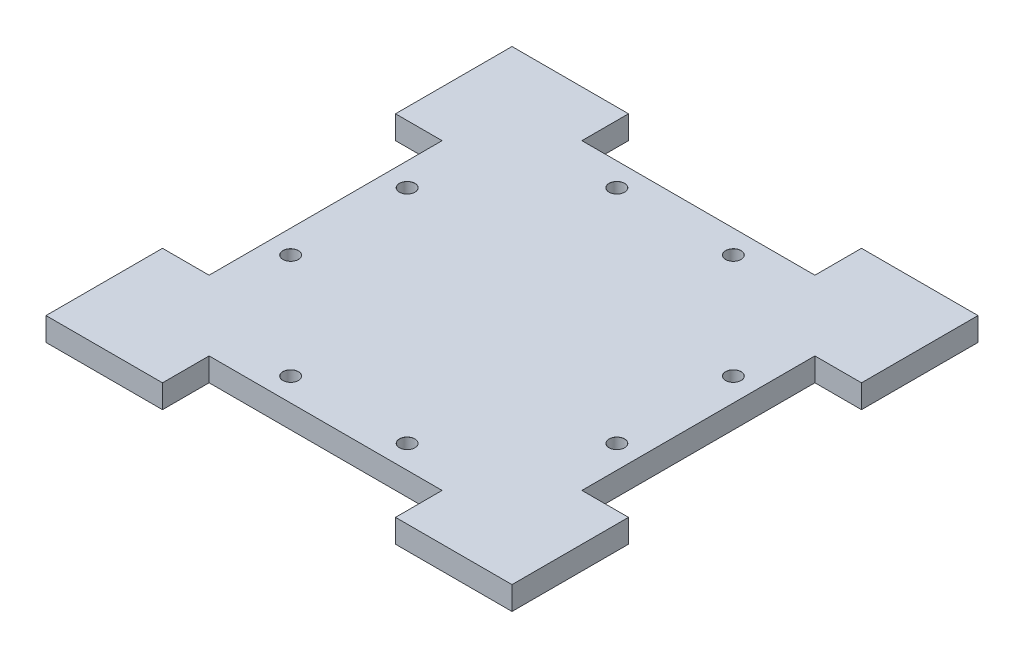
ISO-10303-21;
HEADER;
FILE_DESCRIPTION(('STEP AP214'),'2;1');
FILE_NAME('part.step','',(''),(''),'','','');
FILE_SCHEMA(('AUTOMOTIVE_DESIGN { 1 0 10303 214 1 1 1 1 }'));
ENDSEC;
DATA;
#1=APPLICATION_CONTEXT('core data for automotive mechanical design processes');
#2=APPLICATION_PROTOCOL_DEFINITION('international standard','automotive_design',2000,#1);
#3=PRODUCT_CONTEXT('',#1,'mechanical');
#4=PRODUCT('Part','Part','',(#3));
#5=PRODUCT_RELATED_PRODUCT_CATEGORY('part','',(#4));
#6=PRODUCT_DEFINITION_FORMATION('','',#4);
#7=PRODUCT_DEFINITION_CONTEXT('part definition',#1,'design');
#8=PRODUCT_DEFINITION('design','',#6,#7);
#9=PRODUCT_DEFINITION_SHAPE('','',#8);
#10=(LENGTH_UNIT() NAMED_UNIT(*) SI_UNIT(.MILLI.,.METRE.));
#11=(NAMED_UNIT(*) PLANE_ANGLE_UNIT() SI_UNIT($,.RADIAN.));
#12=(NAMED_UNIT(*) SI_UNIT($,.STERADIAN.) SOLID_ANGLE_UNIT());
#13=UNCERTAINTY_MEASURE_WITH_UNIT(LENGTH_MEASURE(1.E-05),#10,'distance_accuracy_value','');
#14=(GEOMETRIC_REPRESENTATION_CONTEXT(3) GLOBAL_UNCERTAINTY_ASSIGNED_CONTEXT((#13)) GLOBAL_UNIT_ASSIGNED_CONTEXT((#10,
#11,#12)) REPRESENTATION_CONTEXT('',''));
#15=CARTESIAN_POINT('',(0.,0.,0.));
#16=DIRECTION('',(0.,0.,1.));
#17=DIRECTION('',(1.,0.,0.));
#18=AXIS2_PLACEMENT_3D('',#15,#16,#17);
#19=CARTESIAN_POINT('',(-50.,10.,-100.));
#20=DIRECTION('',(-1.,0.,0.));
#21=DIRECTION('',(0.,0.,1.));
#22=AXIS2_PLACEMENT_3D('',#19,#20,#21);
#23=PLANE('',#22);
#24=DIRECTION('',(0.,0.,-1.));
#25=VECTOR('',#24,1.);
#26=CARTESIAN_POINT('',(-50.,0.,-100.));
#27=LINE('',#26,#25);
#28=CARTESIAN_POINT('',(-50.,0.,-80.));
#29=VERTEX_POINT('',#28);
#30=CARTESIAN_POINT('',(-50.,0.,-100.));
#31=VERTEX_POINT('',#30);
#32=EDGE_CURVE('E211',#29,#31,#27,.T.);
#33=ORIENTED_EDGE('',*,*,#32,.T.);
#34=DIRECTION('',(0.,-1.,0.));
#35=VECTOR('',#34,1.);
#36=CARTESIAN_POINT('',(-50.,10.,-100.));
#37=LINE('',#36,#35);
#38=CARTESIAN_POINT('',(-50.,10.,-100.));
#39=VERTEX_POINT('',#38);
#40=EDGE_CURVE('E11',#39,#31,#37,.T.);
#41=ORIENTED_EDGE('',*,*,#40,.F.);
#42=DIRECTION('',(0.,0.,-1.));
#43=VECTOR('',#42,1.);
#44=CARTESIAN_POINT('',(-50.,10.,-100.));
#45=LINE('',#44,#43);
#46=CARTESIAN_POINT('',(-50.,10.,-80.));
#47=VERTEX_POINT('',#46);
#48=EDGE_CURVE('E250',#47,#39,#45,.T.);
#49=ORIENTED_EDGE('',*,*,#48,.F.);
#50=DIRECTION('',(0.,-1.,0.));
#51=VECTOR('',#50,1.);
#52=CARTESIAN_POINT('',(-50.,10.,-80.));
#53=LINE('',#52,#51);
#54=EDGE_CURVE('E207',#47,#29,#53,.T.);
#55=ORIENTED_EDGE('',*,*,#54,.T.);
#56=EDGE_LOOP('',(#33,#41,#49,#55));
#57=FACE_BOUND('',#56,.T.);
#58=ADVANCED_FACE('F43',(#57),#23,.F.);
#59=CARTESIAN_POINT('',(-100.,10.,-100.));
#60=DIRECTION('',(0.,0.,1.));
#61=DIRECTION('',(1.,0.,0.));
#62=AXIS2_PLACEMENT_3D('',#59,#60,#61);
#63=PLANE('',#62);
#64=DIRECTION('',(-1.,0.,0.));
#65=VECTOR('',#64,1.);
#66=CARTESIAN_POINT('',(-100.,0.,-100.));
#67=LINE('',#66,#65);
#68=CARTESIAN_POINT('',(-100.,0.,-100.));
#69=VERTEX_POINT('',#68);
#70=EDGE_CURVE('E214',#31,#69,#67,.T.);
#71=ORIENTED_EDGE('',*,*,#70,.T.);
#72=DIRECTION('',(0.,-1.,0.));
#73=VECTOR('',#72,1.);
#74=CARTESIAN_POINT('',(-100.,10.,-100.));
#75=LINE('',#74,#73);
#76=CARTESIAN_POINT('',(-100.,10.,-100.));
#77=VERTEX_POINT('',#76);
#78=EDGE_CURVE('E51',#77,#69,#75,.T.);
#79=ORIENTED_EDGE('',*,*,#78,.F.);
#80=DIRECTION('',(-1.,0.,0.));
#81=VECTOR('',#80,1.);
#82=CARTESIAN_POINT('',(-100.,10.,-100.));
#83=LINE('',#82,#81);
#84=EDGE_CURVE('E138',#39,#77,#83,.T.);
#85=ORIENTED_EDGE('',*,*,#84,.F.);
#86=ORIENTED_EDGE('',*,*,#40,.T.);
#87=EDGE_LOOP('',(#71,#79,#85,#86));
#88=FACE_BOUND('',#87,.T.);
#89=ADVANCED_FACE('F369',(#88),#63,.F.);
#90=CARTESIAN_POINT('',(-100.,10.,-50.));
#91=DIRECTION('',(1.,0.,0.));
#92=DIRECTION('',(0.,0.,-1.));
#93=AXIS2_PLACEMENT_3D('',#90,#91,#92);
#94=PLANE('',#93);
#95=DIRECTION('',(0.,0.,1.));
#96=VECTOR('',#95,1.);
#97=CARTESIAN_POINT('',(-100.,0.,-50.));
#98=LINE('',#97,#96);
#99=CARTESIAN_POINT('',(-100.,0.,-50.));
#100=VERTEX_POINT('',#99);
#101=EDGE_CURVE('E217',#69,#100,#98,.T.);
#102=ORIENTED_EDGE('',*,*,#101,.T.);
#103=DIRECTION('',(0.,-1.,0.));
#104=VECTOR('',#103,1.);
#105=CARTESIAN_POINT('',(-100.,10.,-50.));
#106=LINE('',#105,#104);
#107=CARTESIAN_POINT('',(-100.,10.,-50.));
#108=VERTEX_POINT('',#107);
#109=EDGE_CURVE('E293',#108,#100,#106,.T.);
#110=ORIENTED_EDGE('',*,*,#109,.F.);
#111=DIRECTION('',(0.,0.,1.));
#112=VECTOR('',#111,1.);
#113=CARTESIAN_POINT('',(-100.,10.,-50.));
#114=LINE('',#113,#112);
#115=EDGE_CURVE('E301',#77,#108,#114,.T.);
#116=ORIENTED_EDGE('',*,*,#115,.F.);
#117=ORIENTED_EDGE('',*,*,#78,.T.);
#118=EDGE_LOOP('',(#102,#110,#116,#117));
#119=FACE_BOUND('',#118,.T.);
#120=ADVANCED_FACE('F299',(#119),#94,.F.);
#121=CARTESIAN_POINT('',(-80.,10.,-50.));
#122=DIRECTION('',(0.,0.,-1.));
#123=DIRECTION('',(-1.,0.,0.));
#124=AXIS2_PLACEMENT_3D('',#121,#122,#123);
#125=PLANE('',#124);
#126=DIRECTION('',(1.,0.,0.));
#127=VECTOR('',#126,1.);
#128=CARTESIAN_POINT('',(-80.,0.,-50.));
#129=LINE('',#128,#127);
#130=CARTESIAN_POINT('',(-80.,0.,-50.));
#131=VERTEX_POINT('',#130);
#132=EDGE_CURVE('E219',#100,#131,#129,.T.);
#133=ORIENTED_EDGE('',*,*,#132,.T.);
#134=DIRECTION('',(0.,-1.,0.));
#135=VECTOR('',#134,1.);
#136=CARTESIAN_POINT('',(-80.,10.,-50.));
#137=LINE('',#136,#135);
#138=CARTESIAN_POINT('',(-80.,10.,-50.));
#139=VERTEX_POINT('',#138);
#140=EDGE_CURVE('E290',#139,#131,#137,.T.);
#141=ORIENTED_EDGE('',*,*,#140,.F.);
#142=DIRECTION('',(1.,0.,0.));
#143=VECTOR('',#142,1.);
#144=CARTESIAN_POINT('',(-80.,10.,-50.));
#145=LINE('',#144,#143);
#146=EDGE_CURVE('E319',#108,#139,#145,.T.);
#147=ORIENTED_EDGE('',*,*,#146,.F.);
#148=ORIENTED_EDGE('',*,*,#109,.T.);
#149=EDGE_LOOP('',(#133,#141,#147,#148));
#150=FACE_BOUND('',#149,.T.);
#151=ADVANCED_FACE('F310',(#150),#125,.F.);
#152=CARTESIAN_POINT('',(-80.,10.,50.));
#153=DIRECTION('',(1.,0.,0.));
#154=DIRECTION('',(0.,0.,-1.));
#155=AXIS2_PLACEMENT_3D('',#152,#153,#154);
#156=PLANE('',#155);
#157=DIRECTION('',(0.,0.,1.));
#158=VECTOR('',#157,1.);
#159=CARTESIAN_POINT('',(-80.,0.,50.));
#160=LINE('',#159,#158);
#161=CARTESIAN_POINT('',(-80.,0.,50.));
#162=VERTEX_POINT('',#161);
#163=EDGE_CURVE('E221',#131,#162,#160,.T.);
#164=ORIENTED_EDGE('',*,*,#163,.T.);
#165=DIRECTION('',(0.,-1.,0.));
#166=VECTOR('',#165,1.);
#167=CARTESIAN_POINT('',(-80.,10.,50.));
#168=LINE('',#167,#166);
#169=CARTESIAN_POINT('',(-80.,10.,50.));
#170=VERTEX_POINT('',#169);
#171=EDGE_CURVE('E287',#170,#162,#168,.T.);
#172=ORIENTED_EDGE('',*,*,#171,.F.);
#173=DIRECTION('',(0.,0.,1.));
#174=VECTOR('',#173,1.);
#175=CARTESIAN_POINT('',(-80.,10.,50.));
#176=LINE('',#175,#174);
#177=EDGE_CURVE('E316',#139,#170,#176,.T.);
#178=ORIENTED_EDGE('',*,*,#177,.F.);
#179=ORIENTED_EDGE('',*,*,#140,.T.);
#180=EDGE_LOOP('',(#164,#172,#178,#179));
#181=FACE_BOUND('',#180,.T.);
#182=ADVANCED_FACE('F314',(#181),#156,.F.);
#183=CARTESIAN_POINT('',(-100.,10.,50.));
#184=DIRECTION('',(0.,0.,1.));
#185=DIRECTION('',(1.,0.,0.));
#186=AXIS2_PLACEMENT_3D('',#183,#184,#185);
#187=PLANE('',#186);
#188=DIRECTION('',(-1.,0.,0.));
#189=VECTOR('',#188,1.);
#190=CARTESIAN_POINT('',(-100.,0.,50.));
#191=LINE('',#190,#189);
#192=CARTESIAN_POINT('',(-100.,0.,50.));
#193=VERTEX_POINT('',#192);
#194=EDGE_CURVE('E223',#162,#193,#191,.T.);
#195=ORIENTED_EDGE('',*,*,#194,.T.);
#196=DIRECTION('',(0.,-1.,0.));
#197=VECTOR('',#196,1.);
#198=CARTESIAN_POINT('',(-100.,10.,50.));
#199=LINE('',#198,#197);
#200=CARTESIAN_POINT('',(-100.,10.,50.));
#201=VERTEX_POINT('',#200);
#202=EDGE_CURVE('E284',#201,#193,#199,.T.);
#203=ORIENTED_EDGE('',*,*,#202,.F.);
#204=DIRECTION('',(-1.,0.,0.));
#205=VECTOR('',#204,1.);
#206=CARTESIAN_POINT('',(-100.,10.,50.));
#207=LINE('',#206,#205);
#208=EDGE_CURVE('E318',#170,#201,#207,.T.);
#209=ORIENTED_EDGE('',*,*,#208,.F.);
#210=ORIENTED_EDGE('',*,*,#171,.T.);
#211=EDGE_LOOP('',(#195,#203,#209,#210));
#212=FACE_BOUND('',#211,.T.);
#213=ADVANCED_FACE('F382',(#212),#187,.F.);
#214=CARTESIAN_POINT('',(-100.,10.,100.));
#215=DIRECTION('',(1.,0.,0.));
#216=DIRECTION('',(0.,0.,-1.));
#217=AXIS2_PLACEMENT_3D('',#214,#215,#216);
#218=PLANE('',#217);
#219=DIRECTION('',(0.,0.,1.));
#220=VECTOR('',#219,1.);
#221=CARTESIAN_POINT('',(-100.,0.,100.));
#222=LINE('',#221,#220);
#223=CARTESIAN_POINT('',(-100.,0.,100.));
#224=VERTEX_POINT('',#223);
#225=EDGE_CURVE('E225',#193,#224,#222,.T.);
#226=ORIENTED_EDGE('',*,*,#225,.T.);
#227=DIRECTION('',(0.,-1.,0.));
#228=VECTOR('',#227,1.);
#229=CARTESIAN_POINT('',(-100.,10.,100.));
#230=LINE('',#229,#228);
#231=CARTESIAN_POINT('',(-100.,10.,100.));
#232=VERTEX_POINT('',#231);
#233=EDGE_CURVE('E281',#232,#224,#230,.T.);
#234=ORIENTED_EDGE('',*,*,#233,.F.);
#235=DIRECTION('',(0.,0.,1.));
#236=VECTOR('',#235,1.);
#237=CARTESIAN_POINT('',(-100.,10.,100.));
#238=LINE('',#237,#236);
#239=EDGE_CURVE('E321',#201,#232,#238,.T.);
#240=ORIENTED_EDGE('',*,*,#239,.F.);
#241=ORIENTED_EDGE('',*,*,#202,.T.);
#242=EDGE_LOOP('',(#226,#234,#240,#241));
#243=FACE_BOUND('',#242,.T.);
#244=ADVANCED_FACE('F385',(#243),#218,.F.);
#245=CARTESIAN_POINT('',(-50.,10.,100.));
#246=DIRECTION('',(0.,0.,-1.));
#247=DIRECTION('',(-1.,0.,0.));
#248=AXIS2_PLACEMENT_3D('',#245,#246,#247);
#249=PLANE('',#248);
#250=DIRECTION('',(1.,0.,0.));
#251=VECTOR('',#250,1.);
#252=CARTESIAN_POINT('',(-50.,0.,100.));
#253=LINE('',#252,#251);
#254=CARTESIAN_POINT('',(-50.,0.,100.));
#255=VERTEX_POINT('',#254);
#256=EDGE_CURVE('E227',#224,#255,#253,.T.);
#257=ORIENTED_EDGE('',*,*,#256,.T.);
#258=DIRECTION('',(0.,-1.,0.));
#259=VECTOR('',#258,1.);
#260=CARTESIAN_POINT('',(-50.,10.,100.));
#261=LINE('',#260,#259);
#262=CARTESIAN_POINT('',(-50.,10.,100.));
#263=VERTEX_POINT('',#262);
#264=EDGE_CURVE('E278',#263,#255,#261,.T.);
#265=ORIENTED_EDGE('',*,*,#264,.F.);
#266=DIRECTION('',(1.,0.,0.));
#267=VECTOR('',#266,1.);
#268=CARTESIAN_POINT('',(-50.,10.,100.));
#269=LINE('',#268,#267);
#270=EDGE_CURVE('E327',#232,#263,#269,.T.);
#271=ORIENTED_EDGE('',*,*,#270,.F.);
#272=ORIENTED_EDGE('',*,*,#233,.T.);
#273=EDGE_LOOP('',(#257,#265,#271,#272));
#274=FACE_BOUND('',#273,.T.);
#275=ADVANCED_FACE('F389',(#274),#249,.F.);
#276=CARTESIAN_POINT('',(-50.,10.,80.));
#277=DIRECTION('',(-1.,0.,0.));
#278=DIRECTION('',(0.,0.,1.));
#279=AXIS2_PLACEMENT_3D('',#276,#277,#278);
#280=PLANE('',#279);
#281=DIRECTION('',(0.,0.,-1.));
#282=VECTOR('',#281,1.);
#283=CARTESIAN_POINT('',(-50.,0.,80.));
#284=LINE('',#283,#282);
#285=CARTESIAN_POINT('',(-50.,0.,80.));
#286=VERTEX_POINT('',#285);
#287=EDGE_CURVE('E229',#255,#286,#284,.T.);
#288=ORIENTED_EDGE('',*,*,#287,.T.);
#289=DIRECTION('',(0.,-1.,0.));
#290=VECTOR('',#289,1.);
#291=CARTESIAN_POINT('',(-50.,10.,80.));
#292=LINE('',#291,#290);
#293=CARTESIAN_POINT('',(-50.,10.,80.));
#294=VERTEX_POINT('',#293);
#295=EDGE_CURVE('E275',#294,#286,#292,.T.);
#296=ORIENTED_EDGE('',*,*,#295,.F.);
#297=DIRECTION('',(0.,0.,-1.));
#298=VECTOR('',#297,1.);
#299=CARTESIAN_POINT('',(-50.,10.,80.));
#300=LINE('',#299,#298);
#301=EDGE_CURVE('E329',#263,#294,#300,.T.);
#302=ORIENTED_EDGE('',*,*,#301,.F.);
#303=ORIENTED_EDGE('',*,*,#264,.T.);
#304=EDGE_LOOP('',(#288,#296,#302,#303));
#305=FACE_BOUND('',#304,.T.);
#306=ADVANCED_FACE('F393',(#305),#280,.F.);
#307=CARTESIAN_POINT('',(50.,10.,80.));
#308=DIRECTION('',(0.,0.,-1.));
#309=DIRECTION('',(-1.,0.,0.));
#310=AXIS2_PLACEMENT_3D('',#307,#308,#309);
#311=PLANE('',#310);
#312=DIRECTION('',(1.,0.,0.));
#313=VECTOR('',#312,1.);
#314=CARTESIAN_POINT('',(50.,0.,80.));
#315=LINE('',#314,#313);
#316=CARTESIAN_POINT('',(50.,0.,80.));
#317=VERTEX_POINT('',#316);
#318=EDGE_CURVE('E231',#286,#317,#315,.T.);
#319=ORIENTED_EDGE('',*,*,#318,.T.);
#320=DIRECTION('',(0.,-1.,0.));
#321=VECTOR('',#320,1.);
#322=CARTESIAN_POINT('',(50.,10.,80.));
#323=LINE('',#322,#321);
#324=CARTESIAN_POINT('',(50.,10.,80.));
#325=VERTEX_POINT('',#324);
#326=EDGE_CURVE('E272',#325,#317,#323,.T.);
#327=ORIENTED_EDGE('',*,*,#326,.F.);
#328=DIRECTION('',(1.,0.,0.));
#329=VECTOR('',#328,1.);
#330=CARTESIAN_POINT('',(50.,10.,80.));
#331=LINE('',#330,#329);
#332=EDGE_CURVE('E331',#294,#325,#331,.T.);
#333=ORIENTED_EDGE('',*,*,#332,.F.);
#334=ORIENTED_EDGE('',*,*,#295,.T.);
#335=EDGE_LOOP('',(#319,#327,#333,#334));
#336=FACE_BOUND('',#335,.T.);
#337=ADVANCED_FACE('F397',(#336),#311,.F.);
#338=CARTESIAN_POINT('',(50.,10.,100.));
#339=DIRECTION('',(1.,0.,0.));
#340=DIRECTION('',(0.,0.,-1.));
#341=AXIS2_PLACEMENT_3D('',#338,#339,#340);
#342=PLANE('',#341);
#343=DIRECTION('',(0.,0.,1.));
#344=VECTOR('',#343,1.);
#345=CARTESIAN_POINT('',(50.,0.,100.));
#346=LINE('',#345,#344);
#347=CARTESIAN_POINT('',(50.,0.,100.));
#348=VERTEX_POINT('',#347);
#349=EDGE_CURVE('E233',#317,#348,#346,.T.);
#350=ORIENTED_EDGE('',*,*,#349,.T.);
#351=DIRECTION('',(0.,-1.,0.));
#352=VECTOR('',#351,1.);
#353=CARTESIAN_POINT('',(50.,10.,100.));
#354=LINE('',#353,#352);
#355=CARTESIAN_POINT('',(50.,10.,100.));
#356=VERTEX_POINT('',#355);
#357=EDGE_CURVE('E269',#356,#348,#354,.T.);
#358=ORIENTED_EDGE('',*,*,#357,.F.);
#359=DIRECTION('',(0.,0.,1.));
#360=VECTOR('',#359,1.);
#361=CARTESIAN_POINT('',(50.,10.,100.));
#362=LINE('',#361,#360);
#363=EDGE_CURVE('E333',#325,#356,#362,.T.);
#364=ORIENTED_EDGE('',*,*,#363,.F.);
#365=ORIENTED_EDGE('',*,*,#326,.T.);
#366=EDGE_LOOP('',(#350,#358,#364,#365));
#367=FACE_BOUND('',#366,.T.);
#368=ADVANCED_FACE('F401',(#367),#342,.F.);
#369=CARTESIAN_POINT('',(100.,10.,100.));
#370=DIRECTION('',(0.,0.,-1.));
#371=DIRECTION('',(-1.,0.,0.));
#372=AXIS2_PLACEMENT_3D('',#369,#370,#371);
#373=PLANE('',#372);
#374=DIRECTION('',(1.,0.,0.));
#375=VECTOR('',#374,1.);
#376=CARTESIAN_POINT('',(100.,0.,100.));
#377=LINE('',#376,#375);
#378=CARTESIAN_POINT('',(100.,0.,100.));
#379=VERTEX_POINT('',#378);
#380=EDGE_CURVE('E235',#348,#379,#377,.T.);
#381=ORIENTED_EDGE('',*,*,#380,.T.);
#382=DIRECTION('',(0.,-1.,0.));
#383=VECTOR('',#382,1.);
#384=CARTESIAN_POINT('',(100.,10.,100.));
#385=LINE('',#384,#383);
#386=CARTESIAN_POINT('',(100.,10.,100.));
#387=VERTEX_POINT('',#386);
#388=EDGE_CURVE('E266',#387,#379,#385,.T.);
#389=ORIENTED_EDGE('',*,*,#388,.F.);
#390=DIRECTION('',(1.,0.,0.));
#391=VECTOR('',#390,1.);
#392=CARTESIAN_POINT('',(100.,10.,100.));
#393=LINE('',#392,#391);
#394=EDGE_CURVE('E335',#356,#387,#393,.T.);
#395=ORIENTED_EDGE('',*,*,#394,.F.);
#396=ORIENTED_EDGE('',*,*,#357,.T.);
#397=EDGE_LOOP('',(#381,#389,#395,#396));
#398=FACE_BOUND('',#397,.T.);
#399=ADVANCED_FACE('F405',(#398),#373,.F.);
#400=CARTESIAN_POINT('',(100.,10.,50.));
#401=DIRECTION('',(-1.,0.,0.));
#402=DIRECTION('',(0.,0.,1.));
#403=AXIS2_PLACEMENT_3D('',#400,#401,#402);
#404=PLANE('',#403);
#405=DIRECTION('',(0.,0.,-1.));
#406=VECTOR('',#405,1.);
#407=CARTESIAN_POINT('',(100.,0.,50.));
#408=LINE('',#407,#406);
#409=CARTESIAN_POINT('',(100.,0.,50.));
#410=VERTEX_POINT('',#409);
#411=EDGE_CURVE('E237',#379,#410,#408,.T.);
#412=ORIENTED_EDGE('',*,*,#411,.T.);
#413=DIRECTION('',(0.,-1.,0.));
#414=VECTOR('',#413,1.);
#415=CARTESIAN_POINT('',(100.,10.,50.));
#416=LINE('',#415,#414);
#417=CARTESIAN_POINT('',(100.,10.,50.));
#418=VERTEX_POINT('',#417);
#419=EDGE_CURVE('E263',#418,#410,#416,.T.);
#420=ORIENTED_EDGE('',*,*,#419,.F.);
#421=DIRECTION('',(0.,0.,-1.));
#422=VECTOR('',#421,1.);
#423=CARTESIAN_POINT('',(100.,10.,50.));
#424=LINE('',#423,#422);
#425=EDGE_CURVE('E337',#387,#418,#424,.T.);
#426=ORIENTED_EDGE('',*,*,#425,.F.);
#427=ORIENTED_EDGE('',*,*,#388,.T.);
#428=EDGE_LOOP('',(#412,#420,#426,#427));
#429=FACE_BOUND('',#428,.T.);
#430=ADVANCED_FACE('F409',(#429),#404,.F.);
#431=CARTESIAN_POINT('',(80.,10.,50.));
#432=DIRECTION('',(0.,0.,1.));
#433=DIRECTION('',(1.,0.,0.));
#434=AXIS2_PLACEMENT_3D('',#431,#432,#433);
#435=PLANE('',#434);
#436=DIRECTION('',(-1.,0.,0.));
#437=VECTOR('',#436,1.);
#438=CARTESIAN_POINT('',(80.,0.,50.));
#439=LINE('',#438,#437);
#440=CARTESIAN_POINT('',(80.,0.,50.));
#441=VERTEX_POINT('',#440);
#442=EDGE_CURVE('E239',#410,#441,#439,.T.);
#443=ORIENTED_EDGE('',*,*,#442,.T.);
#444=DIRECTION('',(0.,-1.,0.));
#445=VECTOR('',#444,1.);
#446=CARTESIAN_POINT('',(80.,10.,50.));
#447=LINE('',#446,#445);
#448=CARTESIAN_POINT('',(80.,10.,50.));
#449=VERTEX_POINT('',#448);
#450=EDGE_CURVE('E260',#449,#441,#447,.T.);
#451=ORIENTED_EDGE('',*,*,#450,.F.);
#452=DIRECTION('',(-1.,0.,0.));
#453=VECTOR('',#452,1.);
#454=CARTESIAN_POINT('',(80.,10.,50.));
#455=LINE('',#454,#453);
#456=EDGE_CURVE('E339',#418,#449,#455,.T.);
#457=ORIENTED_EDGE('',*,*,#456,.F.);
#458=ORIENTED_EDGE('',*,*,#419,.T.);
#459=EDGE_LOOP('',(#443,#451,#457,#458));
#460=FACE_BOUND('',#459,.T.);
#461=ADVANCED_FACE('F413',(#460),#435,.F.);
#462=CARTESIAN_POINT('',(80.,10.,-50.));
#463=DIRECTION('',(-1.,0.,0.));
#464=DIRECTION('',(0.,0.,1.));
#465=AXIS2_PLACEMENT_3D('',#462,#463,#464);
#466=PLANE('',#465);
#467=DIRECTION('',(0.,0.,-1.));
#468=VECTOR('',#467,1.);
#469=CARTESIAN_POINT('',(80.,0.,-50.));
#470=LINE('',#469,#468);
#471=CARTESIAN_POINT('',(80.,0.,-50.));
#472=VERTEX_POINT('',#471);
#473=EDGE_CURVE('E241',#441,#472,#470,.T.);
#474=ORIENTED_EDGE('',*,*,#473,.T.);
#475=DIRECTION('',(0.,-1.,0.));
#476=VECTOR('',#475,1.);
#477=CARTESIAN_POINT('',(80.,10.,-50.));
#478=LINE('',#477,#476);
#479=CARTESIAN_POINT('',(80.,10.,-50.));
#480=VERTEX_POINT('',#479);
#481=EDGE_CURVE('E257',#480,#472,#478,.T.);
#482=ORIENTED_EDGE('',*,*,#481,.F.);
#483=DIRECTION('',(0.,0.,-1.));
#484=VECTOR('',#483,1.);
#485=CARTESIAN_POINT('',(80.,10.,-50.));
#486=LINE('',#485,#484);
#487=EDGE_CURVE('E341',#449,#480,#486,.T.);
#488=ORIENTED_EDGE('',*,*,#487,.F.);
#489=ORIENTED_EDGE('',*,*,#450,.T.);
#490=EDGE_LOOP('',(#474,#482,#488,#489));
#491=FACE_BOUND('',#490,.T.);
#492=ADVANCED_FACE('F417',(#491),#466,.F.);
#493=CARTESIAN_POINT('',(100.,10.,-50.));
#494=DIRECTION('',(0.,0.,-1.));
#495=DIRECTION('',(-1.,0.,0.));
#496=AXIS2_PLACEMENT_3D('',#493,#494,#495);
#497=PLANE('',#496);
#498=DIRECTION('',(1.,0.,0.));
#499=VECTOR('',#498,1.);
#500=CARTESIAN_POINT('',(100.,0.,-50.));
#501=LINE('',#500,#499);
#502=CARTESIAN_POINT('',(100.,0.,-50.));
#503=VERTEX_POINT('',#502);
#504=EDGE_CURVE('E243',#472,#503,#501,.T.);
#505=ORIENTED_EDGE('',*,*,#504,.T.);
#506=DIRECTION('',(0.,-1.,0.));
#507=VECTOR('',#506,1.);
#508=CARTESIAN_POINT('',(100.,10.,-50.));
#509=LINE('',#508,#507);
#510=CARTESIAN_POINT('',(100.,10.,-50.));
#511=VERTEX_POINT('',#510);
#512=EDGE_CURVE('E254',#511,#503,#509,.T.);
#513=ORIENTED_EDGE('',*,*,#512,.F.);
#514=DIRECTION('',(1.,0.,0.));
#515=VECTOR('',#514,1.);
#516=CARTESIAN_POINT('',(100.,10.,-50.));
#517=LINE('',#516,#515);
#518=EDGE_CURVE('E343',#480,#511,#517,.T.);
#519=ORIENTED_EDGE('',*,*,#518,.F.);
#520=ORIENTED_EDGE('',*,*,#481,.T.);
#521=EDGE_LOOP('',(#505,#513,#519,#520));
#522=FACE_BOUND('',#521,.T.);
#523=ADVANCED_FACE('F349',(#522),#497,.F.);
#524=CARTESIAN_POINT('',(100.,10.,-100.));
#525=DIRECTION('',(-1.,0.,0.));
#526=DIRECTION('',(0.,0.,1.));
#527=AXIS2_PLACEMENT_3D('',#524,#525,#526);
#528=PLANE('',#527);
#529=DIRECTION('',(0.,0.,-1.));
#530=VECTOR('',#529,1.);
#531=CARTESIAN_POINT('',(100.,0.,-100.));
#532=LINE('',#531,#530);
#533=CARTESIAN_POINT('',(100.,0.,-100.));
#534=VERTEX_POINT('',#533);
#535=EDGE_CURVE('E245',#503,#534,#532,.T.);
#536=ORIENTED_EDGE('',*,*,#535,.T.);
#537=DIRECTION('',(0.,-1.,0.));
#538=VECTOR('',#537,1.);
#539=CARTESIAN_POINT('',(100.,10.,-100.));
#540=LINE('',#539,#538);
#541=CARTESIAN_POINT('',(100.,10.,-100.));
#542=VERTEX_POINT('',#541);
#543=EDGE_CURVE('E202',#542,#534,#540,.T.);
#544=ORIENTED_EDGE('',*,*,#543,.F.);
#545=DIRECTION('',(0.,0.,-1.));
#546=VECTOR('',#545,1.);
#547=CARTESIAN_POINT('',(100.,10.,-100.));
#548=LINE('',#547,#546);
#549=EDGE_CURVE('E193',#511,#542,#548,.T.);
#550=ORIENTED_EDGE('',*,*,#549,.F.);
#551=ORIENTED_EDGE('',*,*,#512,.T.);
#552=EDGE_LOOP('',(#536,#544,#550,#551));
#553=FACE_BOUND('',#552,.T.);
#554=ADVANCED_FACE('F353',(#553),#528,.F.);
#555=CARTESIAN_POINT('',(50.,10.,-100.));
#556=DIRECTION('',(0.,0.,1.));
#557=DIRECTION('',(1.,0.,0.));
#558=AXIS2_PLACEMENT_3D('',#555,#556,#557);
#559=PLANE('',#558);
#560=DIRECTION('',(-1.,0.,0.));
#561=VECTOR('',#560,1.);
#562=CARTESIAN_POINT('',(50.,0.,-100.));
#563=LINE('',#562,#561);
#564=CARTESIAN_POINT('',(50.,0.,-100.));
#565=VERTEX_POINT('',#564);
#566=EDGE_CURVE('E201',#534,#565,#563,.T.);
#567=ORIENTED_EDGE('',*,*,#566,.T.);
#568=DIRECTION('',(0.,-1.,0.));
#569=VECTOR('',#568,1.);
#570=CARTESIAN_POINT('',(50.,10.,-100.));
#571=LINE('',#570,#569);
#572=CARTESIAN_POINT('',(50.,10.,-100.));
#573=VERTEX_POINT('',#572);
#574=EDGE_CURVE('E198',#573,#565,#571,.T.);
#575=ORIENTED_EDGE('',*,*,#574,.F.);
#576=DIRECTION('',(-1.,0.,0.));
#577=VECTOR('',#576,1.);
#578=CARTESIAN_POINT('',(50.,10.,-100.));
#579=LINE('',#578,#577);
#580=EDGE_CURVE('E187',#542,#573,#579,.T.);
#581=ORIENTED_EDGE('',*,*,#580,.F.);
#582=ORIENTED_EDGE('',*,*,#543,.T.);
#583=EDGE_LOOP('',(#567,#575,#581,#582));
#584=FACE_BOUND('',#583,.T.);
#585=ADVANCED_FACE('F199',(#584),#559,.F.);
#586=CARTESIAN_POINT('',(50.,10.,-80.));
#587=DIRECTION('',(1.,0.,0.));
#588=DIRECTION('',(0.,0.,-1.));
#589=AXIS2_PLACEMENT_3D('',#586,#587,#588);
#590=PLANE('',#589);
#591=DIRECTION('',(0.,0.,1.));
#592=VECTOR('',#591,1.);
#593=CARTESIAN_POINT('',(50.,0.,-80.));
#594=LINE('',#593,#592);
#595=CARTESIAN_POINT('',(50.,0.,-80.));
#596=VERTEX_POINT('',#595);
#597=EDGE_CURVE('E124',#565,#596,#594,.T.);
#598=ORIENTED_EDGE('',*,*,#597,.T.);
#599=DIRECTION('',(0.,-1.,0.));
#600=VECTOR('',#599,1.);
#601=CARTESIAN_POINT('',(50.,10.,-80.));
#602=LINE('',#601,#600);
#603=CARTESIAN_POINT('',(50.,10.,-80.));
#604=VERTEX_POINT('',#603);
#605=EDGE_CURVE('E203',#604,#596,#602,.T.);
#606=ORIENTED_EDGE('',*,*,#605,.F.);
#607=DIRECTION('',(0.,0.,1.));
#608=VECTOR('',#607,1.);
#609=CARTESIAN_POINT('',(50.,10.,-80.));
#610=LINE('',#609,#608);
#611=EDGE_CURVE('E191',#573,#604,#610,.T.);
#612=ORIENTED_EDGE('',*,*,#611,.F.);
#613=ORIENTED_EDGE('',*,*,#574,.T.);
#614=EDGE_LOOP('',(#598,#606,#612,#613));
#615=FACE_BOUND('',#614,.T.);
#616=ADVANCED_FACE('F205',(#615),#590,.F.);
#617=CARTESIAN_POINT('',(-50.,10.,-80.));
#618=DIRECTION('',(0.,0.,1.));
#619=DIRECTION('',(1.,0.,0.));
#620=AXIS2_PLACEMENT_3D('',#617,#618,#619);
#621=PLANE('',#620);
#622=DIRECTION('',(-1.,0.,0.));
#623=VECTOR('',#622,1.);
#624=CARTESIAN_POINT('',(-50.,0.,-80.));
#625=LINE('',#624,#623);
#626=EDGE_CURVE('E130',#596,#29,#625,.T.);
#627=ORIENTED_EDGE('',*,*,#626,.T.);
#628=ORIENTED_EDGE('',*,*,#54,.F.);
#629=DIRECTION('',(-1.,0.,0.));
#630=VECTOR('',#629,1.);
#631=CARTESIAN_POINT('',(-50.,10.,-80.));
#632=LINE('',#631,#630);
#633=EDGE_CURVE('E59',#604,#47,#632,.T.);
#634=ORIENTED_EDGE('',*,*,#633,.F.);
#635=ORIENTED_EDGE('',*,*,#605,.T.);
#636=EDGE_LOOP('',(#627,#628,#634,#635));
#637=FACE_BOUND('',#636,.T.);
#638=ADVANCED_FACE('F357',(#637),#621,.F.);
#639=CARTESIAN_POINT('',(0.,10.,0.));
#640=DIRECTION('',(0.,1.,0.));
#641=DIRECTION('',(0.,0.,1.));
#642=AXIS2_PLACEMENT_3D('',#639,#640,#641);
#643=PLANE('',#642);
#644=CARTESIAN_POINT('',(-70.,10.,25.));
#645=DIRECTION('',(0.,1.,0.));
#646=DIRECTION('',(0.,0.,1.));
#647=AXIS2_PLACEMENT_3D('',#644,#645,#646);
#648=CIRCLE('',#647,3.32499999999999);
#649=CARTESIAN_POINT('',(-70.,10.,28.325));
#650=VERTEX_POINT('',#649);
#651=EDGE_CURVE('E797',#650,#650,#648,.T.);
#652=ORIENTED_EDGE('',*,*,#651,.F.);
#653=EDGE_LOOP('',(#652));
#654=FACE_BOUND('',#653,.T.);
#655=CARTESIAN_POINT('',(-70.,10.,-25.));
#656=DIRECTION('',(0.,1.,0.));
#657=DIRECTION('',(0.,0.,1.));
#658=AXIS2_PLACEMENT_3D('',#655,#656,#657);
#659=CIRCLE('',#658,3.32499999999999);
#660=CARTESIAN_POINT('',(-70.,10.,-21.675));
#661=VERTEX_POINT('',#660);
#662=EDGE_CURVE('E804',#661,#661,#659,.T.);
#663=ORIENTED_EDGE('',*,*,#662,.F.);
#664=EDGE_LOOP('',(#663));
#665=FACE_BOUND('',#664,.T.);
#666=CARTESIAN_POINT('',(-25.,10.,-70.));
#667=DIRECTION('',(0.,1.,0.));
#668=DIRECTION('',(0.,0.,1.));
#669=AXIS2_PLACEMENT_3D('',#666,#667,#668);
#670=CIRCLE('',#669,3.325);
#671=CARTESIAN_POINT('',(-25.,10.,-66.675));
#672=VERTEX_POINT('',#671);
#673=EDGE_CURVE('E813',#672,#672,#670,.T.);
#674=ORIENTED_EDGE('',*,*,#673,.F.);
#675=EDGE_LOOP('',(#674));
#676=FACE_BOUND('',#675,.T.);
#677=CARTESIAN_POINT('',(25.,10.,-70.));
#678=DIRECTION('',(0.,1.,0.));
#679=DIRECTION('',(0.,0.,1.));
#680=AXIS2_PLACEMENT_3D('',#677,#678,#679);
#681=CIRCLE('',#680,3.325);
#682=CARTESIAN_POINT('',(25.,10.,-66.675));
#683=VERTEX_POINT('',#682);
#684=EDGE_CURVE('E822',#683,#683,#681,.T.);
#685=ORIENTED_EDGE('',*,*,#684,.F.);
#686=EDGE_LOOP('',(#685));
#687=FACE_BOUND('',#686,.T.);
#688=CARTESIAN_POINT('',(70.,10.,-25.));
#689=DIRECTION('',(0.,1.,0.));
#690=DIRECTION('',(0.,0.,1.));
#691=AXIS2_PLACEMENT_3D('',#688,#689,#690);
#692=CIRCLE('',#691,3.32499999999999);
#693=CARTESIAN_POINT('',(70.,10.,-21.675));
#694=VERTEX_POINT('',#693);
#695=EDGE_CURVE('E831',#694,#694,#692,.T.);
#696=ORIENTED_EDGE('',*,*,#695,.F.);
#697=EDGE_LOOP('',(#696));
#698=FACE_BOUND('',#697,.T.);
#699=CARTESIAN_POINT('',(70.,10.,25.));
#700=DIRECTION('',(0.,1.,0.));
#701=DIRECTION('',(0.,0.,1.));
#702=AXIS2_PLACEMENT_3D('',#699,#700,#701);
#703=CIRCLE('',#702,3.32499999999999);
#704=CARTESIAN_POINT('',(70.,10.,28.325));
#705=VERTEX_POINT('',#704);
#706=EDGE_CURVE('E840',#705,#705,#703,.T.);
#707=ORIENTED_EDGE('',*,*,#706,.F.);
#708=EDGE_LOOP('',(#707));
#709=FACE_BOUND('',#708,.T.);
#710=CARTESIAN_POINT('',(-25.,10.,70.));
#711=DIRECTION('',(0.,1.,0.));
#712=DIRECTION('',(0.,0.,1.));
#713=AXIS2_PLACEMENT_3D('',#710,#711,#712);
#714=CIRCLE('',#713,3.325);
#715=CARTESIAN_POINT('',(-25.,10.,73.325));
#716=VERTEX_POINT('',#715);
#717=EDGE_CURVE('E849',#716,#716,#714,.T.);
#718=ORIENTED_EDGE('',*,*,#717,.F.);
#719=EDGE_LOOP('',(#718));
#720=FACE_BOUND('',#719,.T.);
#721=CARTESIAN_POINT('',(25.,10.,70.));
#722=DIRECTION('',(0.,1.,0.));
#723=DIRECTION('',(0.,0.,1.));
#724=AXIS2_PLACEMENT_3D('',#721,#722,#723);
#725=CIRCLE('',#724,3.325);
#726=CARTESIAN_POINT('',(25.,10.,73.325));
#727=VERTEX_POINT('',#726);
#728=EDGE_CURVE('E858',#727,#727,#725,.T.);
#729=ORIENTED_EDGE('',*,*,#728,.F.);
#730=EDGE_LOOP('',(#729));
#731=FACE_BOUND('',#730,.T.);
#732=ORIENTED_EDGE('',*,*,#48,.T.);
#733=ORIENTED_EDGE('',*,*,#84,.T.);
#734=ORIENTED_EDGE('',*,*,#115,.T.);
#735=ORIENTED_EDGE('',*,*,#146,.T.);
#736=ORIENTED_EDGE('',*,*,#177,.T.);
#737=ORIENTED_EDGE('',*,*,#208,.T.);
#738=ORIENTED_EDGE('',*,*,#239,.T.);
#739=ORIENTED_EDGE('',*,*,#270,.T.);
#740=ORIENTED_EDGE('',*,*,#301,.T.);
#741=ORIENTED_EDGE('',*,*,#332,.T.);
#742=ORIENTED_EDGE('',*,*,#363,.T.);
#743=ORIENTED_EDGE('',*,*,#394,.T.);
#744=ORIENTED_EDGE('',*,*,#425,.T.);
#745=ORIENTED_EDGE('',*,*,#456,.T.);
#746=ORIENTED_EDGE('',*,*,#487,.T.);
#747=ORIENTED_EDGE('',*,*,#518,.T.);
#748=ORIENTED_EDGE('',*,*,#549,.T.);
#749=ORIENTED_EDGE('',*,*,#580,.T.);
#750=ORIENTED_EDGE('',*,*,#611,.T.);
#751=ORIENTED_EDGE('',*,*,#633,.T.);
#752=EDGE_LOOP('',(#732,#733,#734,#735,#736,#737,#738,#739,#740,#741,#742,#743,#744,#745,#746,
#747,#748,#749,#750,#751));
#753=FACE_BOUND('',#752,.T.);
#754=ADVANCED_FACE('F189',(#654,#665,#676,#687,#698,#709,#720,#731,#753),#643,.T.);
#755=CARTESIAN_POINT('',(0.,0.,0.));
#756=DIRECTION('',(0.,1.,0.));
#757=DIRECTION('',(0.,0.,1.));
#758=AXIS2_PLACEMENT_3D('',#755,#756,#757);
#759=PLANE('',#758);
#760=CARTESIAN_POINT('',(-70.,0.,25.));
#761=DIRECTION('',(0.,1.,0.));
#762=DIRECTION('',(0.,0.,1.));
#763=AXIS2_PLACEMENT_3D('',#760,#761,#762);
#764=CIRCLE('',#763,3.3);
#765=CARTESIAN_POINT('',(-70.,0.,28.3));
#766=VERTEX_POINT('',#765);
#767=EDGE_CURVE('E799',#766,#766,#764,.T.);
#768=ORIENTED_EDGE('',*,*,#767,.T.);
#769=EDGE_LOOP('',(#768));
#770=FACE_BOUND('',#769,.T.);
#771=CARTESIAN_POINT('',(-70.,0.,-25.));
#772=DIRECTION('',(0.,1.,0.));
#773=DIRECTION('',(0.,0.,1.));
#774=AXIS2_PLACEMENT_3D('',#771,#772,#773);
#775=CIRCLE('',#774,3.3);
#776=CARTESIAN_POINT('',(-70.,0.,-21.7));
#777=VERTEX_POINT('',#776);
#778=EDGE_CURVE('E810',#777,#777,#775,.T.);
#779=ORIENTED_EDGE('',*,*,#778,.T.);
#780=EDGE_LOOP('',(#779));
#781=FACE_BOUND('',#780,.T.);
#782=CARTESIAN_POINT('',(-25.,0.,-70.));
#783=DIRECTION('',(0.,1.,0.));
#784=DIRECTION('',(0.,0.,1.));
#785=AXIS2_PLACEMENT_3D('',#782,#783,#784);
#786=CIRCLE('',#785,3.29999999999999);
#787=CARTESIAN_POINT('',(-25.,0.,-66.7));
#788=VERTEX_POINT('',#787);
#789=EDGE_CURVE('E819',#788,#788,#786,.T.);
#790=ORIENTED_EDGE('',*,*,#789,.T.);
#791=EDGE_LOOP('',(#790));
#792=FACE_BOUND('',#791,.T.);
#793=CARTESIAN_POINT('',(25.,0.,-70.));
#794=DIRECTION('',(0.,1.,0.));
#795=DIRECTION('',(0.,0.,1.));
#796=AXIS2_PLACEMENT_3D('',#793,#794,#795);
#797=CIRCLE('',#796,3.29999999999999);
#798=CARTESIAN_POINT('',(25.,0.,-66.7));
#799=VERTEX_POINT('',#798);
#800=EDGE_CURVE('E828',#799,#799,#797,.T.);
#801=ORIENTED_EDGE('',*,*,#800,.T.);
#802=EDGE_LOOP('',(#801));
#803=FACE_BOUND('',#802,.T.);
#804=CARTESIAN_POINT('',(70.,0.,-25.));
#805=DIRECTION('',(0.,1.,0.));
#806=DIRECTION('',(0.,0.,1.));
#807=AXIS2_PLACEMENT_3D('',#804,#805,#806);
#808=CIRCLE('',#807,3.3);
#809=CARTESIAN_POINT('',(70.,0.,-21.7));
#810=VERTEX_POINT('',#809);
#811=EDGE_CURVE('E837',#810,#810,#808,.T.);
#812=ORIENTED_EDGE('',*,*,#811,.T.);
#813=EDGE_LOOP('',(#812));
#814=FACE_BOUND('',#813,.T.);
#815=CARTESIAN_POINT('',(70.,0.,25.));
#816=DIRECTION('',(0.,1.,0.));
#817=DIRECTION('',(0.,0.,1.));
#818=AXIS2_PLACEMENT_3D('',#815,#816,#817);
#819=CIRCLE('',#818,3.3);
#820=CARTESIAN_POINT('',(70.,0.,28.3));
#821=VERTEX_POINT('',#820);
#822=EDGE_CURVE('E846',#821,#821,#819,.T.);
#823=ORIENTED_EDGE('',*,*,#822,.T.);
#824=EDGE_LOOP('',(#823));
#825=FACE_BOUND('',#824,.T.);
#826=CARTESIAN_POINT('',(-25.,0.,70.));
#827=DIRECTION('',(0.,1.,0.));
#828=DIRECTION('',(0.,0.,1.));
#829=AXIS2_PLACEMENT_3D('',#826,#827,#828);
#830=CIRCLE('',#829,3.29999999999999);
#831=CARTESIAN_POINT('',(-25.,0.,73.3));
#832=VERTEX_POINT('',#831);
#833=EDGE_CURVE('E855',#832,#832,#830,.T.);
#834=ORIENTED_EDGE('',*,*,#833,.T.);
#835=EDGE_LOOP('',(#834));
#836=FACE_BOUND('',#835,.T.);
#837=CARTESIAN_POINT('',(25.,0.,70.));
#838=DIRECTION('',(0.,1.,0.));
#839=DIRECTION('',(0.,0.,1.));
#840=AXIS2_PLACEMENT_3D('',#837,#838,#839);
#841=CIRCLE('',#840,3.29999999999999);
#842=CARTESIAN_POINT('',(25.,0.,73.3));
#843=VERTEX_POINT('',#842);
#844=EDGE_CURVE('E215',#843,#843,#841,.T.);
#845=ORIENTED_EDGE('',*,*,#844,.T.);
#846=EDGE_LOOP('',(#845));
#847=FACE_BOUND('',#846,.T.);
#848=ORIENTED_EDGE('',*,*,#32,.F.);
#849=ORIENTED_EDGE('',*,*,#626,.F.);
#850=ORIENTED_EDGE('',*,*,#597,.F.);
#851=ORIENTED_EDGE('',*,*,#566,.F.);
#852=ORIENTED_EDGE('',*,*,#535,.F.);
#853=ORIENTED_EDGE('',*,*,#504,.F.);
#854=ORIENTED_EDGE('',*,*,#473,.F.);
#855=ORIENTED_EDGE('',*,*,#442,.F.);
#856=ORIENTED_EDGE('',*,*,#411,.F.);
#857=ORIENTED_EDGE('',*,*,#380,.F.);
#858=ORIENTED_EDGE('',*,*,#349,.F.);
#859=ORIENTED_EDGE('',*,*,#318,.F.);
#860=ORIENTED_EDGE('',*,*,#287,.F.);
#861=ORIENTED_EDGE('',*,*,#256,.F.);
#862=ORIENTED_EDGE('',*,*,#225,.F.);
#863=ORIENTED_EDGE('',*,*,#194,.F.);
#864=ORIENTED_EDGE('',*,*,#163,.F.);
#865=ORIENTED_EDGE('',*,*,#132,.F.);
#866=ORIENTED_EDGE('',*,*,#101,.F.);
#867=ORIENTED_EDGE('',*,*,#70,.F.);
#868=EDGE_LOOP('',(#848,#849,#850,#851,#852,#853,#854,#855,#856,#857,#858,#859,#860,#861,#862,
#863,#864,#865,#866,#867));
#869=FACE_BOUND('',#868,.T.);
#870=ADVANCED_FACE('F305',(#770,#781,#792,#803,#814,#825,#836,#847,#869),#759,.F.);
#871=CARTESIAN_POINT('',(25.,10.,70.));
#872=DIRECTION('',(0.,1.,0.));
#873=DIRECTION('',(0.,0.,1.));
#874=AXIS2_PLACEMENT_3D('',#871,#872,#873);
#875=CYLINDRICAL_SURFACE('',#874,3.29999999999999);
#876=ORIENTED_EDGE('',*,*,#844,.F.);
#877=EDGE_LOOP('',(#876));
#878=FACE_BOUND('',#877,.T.);
#879=CARTESIAN_POINT('',(25.,9.97902250922056,70.));
#880=DIRECTION('',(0.,1.,0.));
#881=DIRECTION('',(0.,0.,1.));
#882=AXIS2_PLACEMENT_3D('',#879,#880,#881);
#883=CIRCLE('',#882,3.29999999999999);
#884=CARTESIAN_POINT('',(25.,9.97902250922056,73.3));
#885=VERTEX_POINT('',#884);
#886=EDGE_CURVE('E861',#885,#885,#883,.T.);
#887=ORIENTED_EDGE('',*,*,#886,.T.);
#888=EDGE_LOOP('',(#887));
#889=FACE_BOUND('',#888,.T.);
#890=ADVANCED_FACE('F457',(#878,#889),#875,.F.);
#891=CARTESIAN_POINT('',(25.,10.,70.));
#892=DIRECTION('',(0.,1.,0.));
#893=DIRECTION('',(0.,0.,1.));
#894=AXIS2_PLACEMENT_3D('',#891,#892,#893);
#895=CONICAL_SURFACE('',#894,3.325,0.87266462599731);
#896=ORIENTED_EDGE('',*,*,#886,.F.);
#897=EDGE_LOOP('',(#896));
#898=FACE_BOUND('',#897,.T.);
#899=ORIENTED_EDGE('',*,*,#728,.T.);
#900=EDGE_LOOP('',(#899));
#901=FACE_BOUND('',#900,.T.);
#902=ADVANCED_FACE('F467',(#898,#901),#895,.F.);
#903=CARTESIAN_POINT('',(-25.,10.,70.));
#904=DIRECTION('',(0.,1.,0.));
#905=DIRECTION('',(0.,0.,1.));
#906=AXIS2_PLACEMENT_3D('',#903,#904,#905);
#907=CYLINDRICAL_SURFACE('',#906,3.29999999999999);
#908=ORIENTED_EDGE('',*,*,#833,.F.);
#909=EDGE_LOOP('',(#908));
#910=FACE_BOUND('',#909,.T.);
#911=CARTESIAN_POINT('',(-25.,9.97902250922056,70.));
#912=DIRECTION('',(0.,1.,0.));
#913=DIRECTION('',(0.,0.,1.));
#914=AXIS2_PLACEMENT_3D('',#911,#912,#913);
#915=CIRCLE('',#914,3.29999999999999);
#916=CARTESIAN_POINT('',(-25.,9.97902250922056,73.3));
#917=VERTEX_POINT('',#916);
#918=EDGE_CURVE('E852',#917,#917,#915,.T.);
#919=ORIENTED_EDGE('',*,*,#918,.T.);
#920=EDGE_LOOP('',(#919));
#921=FACE_BOUND('',#920,.T.);
#922=ADVANCED_FACE('F478',(#910,#921),#907,.F.);
#923=CARTESIAN_POINT('',(-25.,10.,70.));
#924=DIRECTION('',(0.,1.,0.));
#925=DIRECTION('',(0.,0.,1.));
#926=AXIS2_PLACEMENT_3D('',#923,#924,#925);
#927=CONICAL_SURFACE('',#926,3.325,0.87266462599731);
#928=ORIENTED_EDGE('',*,*,#918,.F.);
#929=EDGE_LOOP('',(#928));
#930=FACE_BOUND('',#929,.T.);
#931=ORIENTED_EDGE('',*,*,#717,.T.);
#932=EDGE_LOOP('',(#931));
#933=FACE_BOUND('',#932,.T.);
#934=ADVANCED_FACE('F489',(#930,#933),#927,.F.);
#935=CARTESIAN_POINT('',(70.,10.,25.));
#936=DIRECTION('',(0.,1.,0.));
#937=DIRECTION('',(0.,0.,1.));
#938=AXIS2_PLACEMENT_3D('',#935,#936,#937);
#939=CYLINDRICAL_SURFACE('',#938,3.29999999999999);
#940=ORIENTED_EDGE('',*,*,#822,.F.);
#941=EDGE_LOOP('',(#940));
#942=FACE_BOUND('',#941,.T.);
#943=CARTESIAN_POINT('',(70.,9.97902250922056,25.));
#944=DIRECTION('',(0.,1.,0.));
#945=DIRECTION('',(0.,0.,1.));
#946=AXIS2_PLACEMENT_3D('',#943,#944,#945);
#947=CIRCLE('',#946,3.29999999999998);
#948=CARTESIAN_POINT('',(70.,9.97902250922056,28.3));
#949=VERTEX_POINT('',#948);
#950=EDGE_CURVE('E843',#949,#949,#947,.T.);
#951=ORIENTED_EDGE('',*,*,#950,.T.);
#952=EDGE_LOOP('',(#951));
#953=FACE_BOUND('',#952,.T.);
#954=ADVANCED_FACE('F500',(#942,#953),#939,.F.);
#955=CARTESIAN_POINT('',(70.,10.,25.));
#956=DIRECTION('',(0.,1.,0.));
#957=DIRECTION('',(0.,0.,1.));
#958=AXIS2_PLACEMENT_3D('',#955,#956,#957);
#959=CONICAL_SURFACE('',#958,3.32499999999999,0.872664625997241);
#960=ORIENTED_EDGE('',*,*,#950,.F.);
#961=EDGE_LOOP('',(#960));
#962=FACE_BOUND('',#961,.T.);
#963=ORIENTED_EDGE('',*,*,#706,.T.);
#964=EDGE_LOOP('',(#963));
#965=FACE_BOUND('',#964,.T.);
#966=ADVANCED_FACE('F511',(#962,#965),#959,.F.);
#967=CARTESIAN_POINT('',(70.,10.,-25.));
#968=DIRECTION('',(0.,1.,0.));
#969=DIRECTION('',(0.,0.,1.));
#970=AXIS2_PLACEMENT_3D('',#967,#968,#969);
#971=CYLINDRICAL_SURFACE('',#970,3.29999999999999);
#972=ORIENTED_EDGE('',*,*,#811,.F.);
#973=EDGE_LOOP('',(#972));
#974=FACE_BOUND('',#973,.T.);
#975=CARTESIAN_POINT('',(70.,9.97902250922056,-25.));
#976=DIRECTION('',(0.,1.,0.));
#977=DIRECTION('',(0.,0.,1.));
#978=AXIS2_PLACEMENT_3D('',#975,#976,#977);
#979=CIRCLE('',#978,3.29999999999998);
#980=CARTESIAN_POINT('',(70.,9.97902250922056,-21.7));
#981=VERTEX_POINT('',#980);
#982=EDGE_CURVE('E834',#981,#981,#979,.T.);
#983=ORIENTED_EDGE('',*,*,#982,.T.);
#984=EDGE_LOOP('',(#983));
#985=FACE_BOUND('',#984,.T.);
#986=ADVANCED_FACE('F522',(#974,#985),#971,.F.);
#987=CARTESIAN_POINT('',(70.,10.,-25.));
#988=DIRECTION('',(0.,1.,0.));
#989=DIRECTION('',(0.,0.,1.));
#990=AXIS2_PLACEMENT_3D('',#987,#988,#989);
#991=CONICAL_SURFACE('',#990,3.32499999999999,0.872664625997241);
#992=ORIENTED_EDGE('',*,*,#982,.F.);
#993=EDGE_LOOP('',(#992));
#994=FACE_BOUND('',#993,.T.);
#995=ORIENTED_EDGE('',*,*,#695,.T.);
#996=EDGE_LOOP('',(#995));
#997=FACE_BOUND('',#996,.T.);
#998=ADVANCED_FACE('F533',(#994,#997),#991,.F.);
#999=CARTESIAN_POINT('',(25.,10.,-70.));
#1000=DIRECTION('',(0.,1.,0.));
#1001=DIRECTION('',(0.,0.,1.));
#1002=AXIS2_PLACEMENT_3D('',#999,#1000,#1001);
#1003=CYLINDRICAL_SURFACE('',#1002,3.29999999999999);
#1004=ORIENTED_EDGE('',*,*,#800,.F.);
#1005=EDGE_LOOP('',(#1004));
#1006=FACE_BOUND('',#1005,.T.);
#1007=CARTESIAN_POINT('',(25.,9.97902250922056,-70.));
#1008=DIRECTION('',(0.,1.,0.));
#1009=DIRECTION('',(0.,0.,1.));
#1010=AXIS2_PLACEMENT_3D('',#1007,#1008,#1009);
#1011=CIRCLE('',#1010,3.29999999999999);
#1012=CARTESIAN_POINT('',(25.,9.97902250922056,-66.7));
#1013=VERTEX_POINT('',#1012);
#1014=EDGE_CURVE('E825',#1013,#1013,#1011,.T.);
#1015=ORIENTED_EDGE('',*,*,#1014,.T.);
#1016=EDGE_LOOP('',(#1015));
#1017=FACE_BOUND('',#1016,.T.);
#1018=ADVANCED_FACE('F544',(#1006,#1017),#1003,.F.);
#1019=CARTESIAN_POINT('',(25.,10.,-70.));
#1020=DIRECTION('',(0.,1.,0.));
#1021=DIRECTION('',(0.,0.,1.));
#1022=AXIS2_PLACEMENT_3D('',#1019,#1020,#1021);
#1023=CONICAL_SURFACE('',#1022,3.325,0.87266462599731);
#1024=ORIENTED_EDGE('',*,*,#1014,.F.);
#1025=EDGE_LOOP('',(#1024));
#1026=FACE_BOUND('',#1025,.T.);
#1027=ORIENTED_EDGE('',*,*,#684,.T.);
#1028=EDGE_LOOP('',(#1027));
#1029=FACE_BOUND('',#1028,.T.);
#1030=ADVANCED_FACE('F555',(#1026,#1029),#1023,.F.);
#1031=CARTESIAN_POINT('',(-25.,10.,-70.));
#1032=DIRECTION('',(0.,1.,0.));
#1033=DIRECTION('',(0.,0.,1.));
#1034=AXIS2_PLACEMENT_3D('',#1031,#1032,#1033);
#1035=CYLINDRICAL_SURFACE('',#1034,3.29999999999999);
#1036=ORIENTED_EDGE('',*,*,#789,.F.);
#1037=EDGE_LOOP('',(#1036));
#1038=FACE_BOUND('',#1037,.T.);
#1039=CARTESIAN_POINT('',(-25.,9.97902250922056,-70.));
#1040=DIRECTION('',(0.,1.,0.));
#1041=DIRECTION('',(0.,0.,1.));
#1042=AXIS2_PLACEMENT_3D('',#1039,#1040,#1041);
#1043=CIRCLE('',#1042,3.29999999999999);
#1044=CARTESIAN_POINT('',(-25.,9.97902250922056,-66.7));
#1045=VERTEX_POINT('',#1044);
#1046=EDGE_CURVE('E816',#1045,#1045,#1043,.T.);
#1047=ORIENTED_EDGE('',*,*,#1046,.T.);
#1048=EDGE_LOOP('',(#1047));
#1049=FACE_BOUND('',#1048,.T.);
#1050=ADVANCED_FACE('F566',(#1038,#1049),#1035,.F.);
#1051=CARTESIAN_POINT('',(-25.,10.,-70.));
#1052=DIRECTION('',(0.,1.,0.));
#1053=DIRECTION('',(0.,0.,1.));
#1054=AXIS2_PLACEMENT_3D('',#1051,#1052,#1053);
#1055=CONICAL_SURFACE('',#1054,3.325,0.87266462599731);
#1056=ORIENTED_EDGE('',*,*,#1046,.F.);
#1057=EDGE_LOOP('',(#1056));
#1058=FACE_BOUND('',#1057,.T.);
#1059=ORIENTED_EDGE('',*,*,#673,.T.);
#1060=EDGE_LOOP('',(#1059));
#1061=FACE_BOUND('',#1060,.T.);
#1062=ADVANCED_FACE('F577',(#1058,#1061),#1055,.F.);
#1063=CARTESIAN_POINT('',(-70.,10.,-25.));
#1064=DIRECTION('',(0.,1.,0.));
#1065=DIRECTION('',(0.,0.,1.));
#1066=AXIS2_PLACEMENT_3D('',#1063,#1064,#1065);
#1067=CYLINDRICAL_SURFACE('',#1066,3.29999999999999);
#1068=ORIENTED_EDGE('',*,*,#778,.F.);
#1069=EDGE_LOOP('',(#1068));
#1070=FACE_BOUND('',#1069,.T.);
#1071=CARTESIAN_POINT('',(-70.,9.97902250922056,-25.));
#1072=DIRECTION('',(0.,1.,0.));
#1073=DIRECTION('',(0.,0.,1.));
#1074=AXIS2_PLACEMENT_3D('',#1071,#1072,#1073);
#1075=CIRCLE('',#1074,3.29999999999998);
#1076=CARTESIAN_POINT('',(-70.,9.97902250922056,-21.7));
#1077=VERTEX_POINT('',#1076);
#1078=EDGE_CURVE('E807',#1077,#1077,#1075,.T.);
#1079=ORIENTED_EDGE('',*,*,#1078,.T.);
#1080=EDGE_LOOP('',(#1079));
#1081=FACE_BOUND('',#1080,.T.);
#1082=ADVANCED_FACE('F588',(#1070,#1081),#1067,.F.);
#1083=CARTESIAN_POINT('',(-70.,10.,-25.));
#1084=DIRECTION('',(0.,1.,0.));
#1085=DIRECTION('',(0.,0.,1.));
#1086=AXIS2_PLACEMENT_3D('',#1083,#1084,#1085);
#1087=CONICAL_SURFACE('',#1086,3.32499999999999,0.872664625997241);
#1088=ORIENTED_EDGE('',*,*,#1078,.F.);
#1089=EDGE_LOOP('',(#1088));
#1090=FACE_BOUND('',#1089,.T.);
#1091=ORIENTED_EDGE('',*,*,#662,.T.);
#1092=EDGE_LOOP('',(#1091));
#1093=FACE_BOUND('',#1092,.T.);
#1094=ADVANCED_FACE('F599',(#1090,#1093),#1087,.F.);
#1095=CARTESIAN_POINT('',(-70.,10.,25.));
#1096=DIRECTION('',(0.,1.,0.));
#1097=DIRECTION('',(0.,0.,1.));
#1098=AXIS2_PLACEMENT_3D('',#1095,#1096,#1097);
#1099=CYLINDRICAL_SURFACE('',#1098,3.29999999999999);
#1100=ORIENTED_EDGE('',*,*,#767,.F.);
#1101=EDGE_LOOP('',(#1100));
#1102=FACE_BOUND('',#1101,.T.);
#1103=CARTESIAN_POINT('',(-70.,9.97902250922056,25.));
#1104=DIRECTION('',(0.,1.,0.));
#1105=DIRECTION('',(0.,0.,1.));
#1106=AXIS2_PLACEMENT_3D('',#1103,#1104,#1105);
#1107=CIRCLE('',#1106,3.29999999999998);
#1108=CARTESIAN_POINT('',(-70.,9.97902250922056,28.3));
#1109=VERTEX_POINT('',#1108);
#1110=EDGE_CURVE('E794',#1109,#1109,#1107,.T.);
#1111=ORIENTED_EDGE('',*,*,#1110,.T.);
#1112=EDGE_LOOP('',(#1111));
#1113=FACE_BOUND('',#1112,.T.);
#1114=ADVANCED_FACE('F610',(#1102,#1113),#1099,.F.);
#1115=CARTESIAN_POINT('',(-70.,10.,25.));
#1116=DIRECTION('',(0.,1.,0.));
#1117=DIRECTION('',(0.,0.,1.));
#1118=AXIS2_PLACEMENT_3D('',#1115,#1116,#1117);
#1119=CONICAL_SURFACE('',#1118,3.32499999999999,0.872664625997241);
#1120=ORIENTED_EDGE('',*,*,#1110,.F.);
#1121=EDGE_LOOP('',(#1120));
#1122=FACE_BOUND('',#1121,.T.);
#1123=ORIENTED_EDGE('',*,*,#651,.T.);
#1124=EDGE_LOOP('',(#1123));
#1125=FACE_BOUND('',#1124,.T.);
#1126=ADVANCED_FACE('F621',(#1122,#1125),#1119,.F.);
#1127=CLOSED_SHELL('',(#58,#89,#120,#151,#182,#213,#244,#275,#306,#337,#368,#399,#430,#461,#492,
#523,#554,#585,#616,#638,#754,#870,#890,#902,#922,#934,#954,#966,#986,#998,#1018,#1030,#1050,
#1062,#1082,#1094,#1114,#1126));
#1128=MANIFOLD_SOLID_BREP('B2',#1127);
#1129=ADVANCED_BREP_SHAPE_REPRESENTATION('',(#18,#1128),#14);
#1130=SHAPE_DEFINITION_REPRESENTATION(#9,#1129);
ENDSEC;
END-ISO-10303-21;
